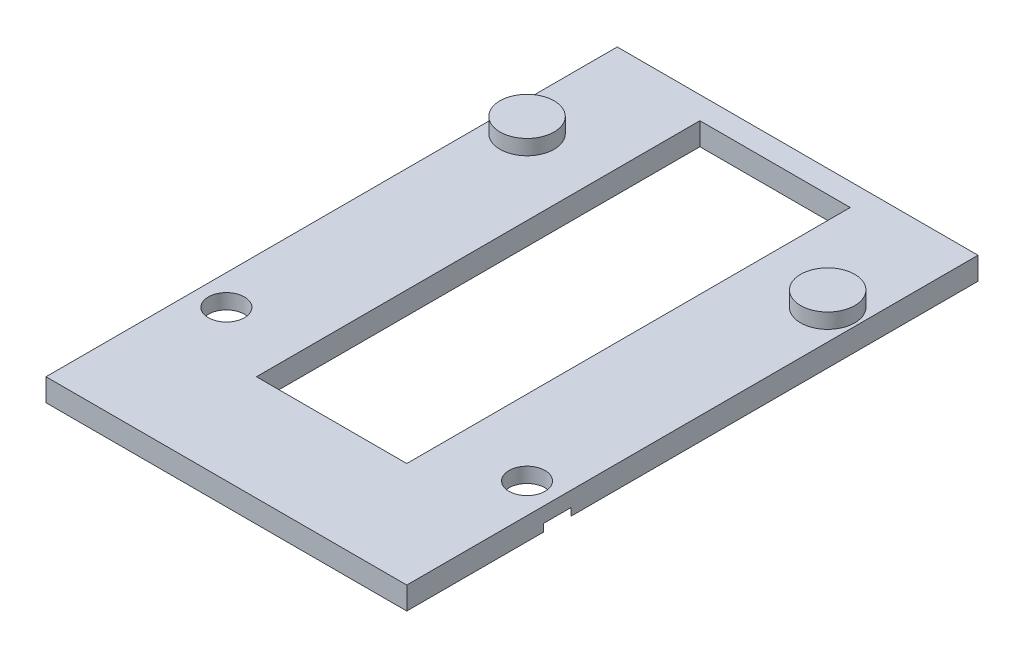
ISO-10303-21;
HEADER;
FILE_DESCRIPTION(('STEP AP214'),'2;1');
FILE_NAME('part.step','',(''),(''),'','','');
FILE_SCHEMA(('AUTOMOTIVE_DESIGN { 1 0 10303 214 1 1 1 1 }'));
ENDSEC;
DATA;
#1=APPLICATION_CONTEXT('core data for automotive mechanical design processes');
#2=APPLICATION_PROTOCOL_DEFINITION('international standard','automotive_design',2000,#1);
#3=PRODUCT_CONTEXT('',#1,'mechanical');
#4=PRODUCT('Part','Part','',(#3));
#5=PRODUCT_RELATED_PRODUCT_CATEGORY('part','',(#4));
#6=PRODUCT_DEFINITION_FORMATION('','',#4);
#7=PRODUCT_DEFINITION_CONTEXT('part definition',#1,'design');
#8=PRODUCT_DEFINITION('design','',#6,#7);
#9=PRODUCT_DEFINITION_SHAPE('','',#8);
#10=(LENGTH_UNIT() NAMED_UNIT(*) SI_UNIT(.MILLI.,.METRE.));
#11=(NAMED_UNIT(*) PLANE_ANGLE_UNIT() SI_UNIT($,.RADIAN.));
#12=(NAMED_UNIT(*) SI_UNIT($,.STERADIAN.) SOLID_ANGLE_UNIT());
#13=UNCERTAINTY_MEASURE_WITH_UNIT(LENGTH_MEASURE(1.E-05),#10,'distance_accuracy_value','');
#14=(GEOMETRIC_REPRESENTATION_CONTEXT(3) GLOBAL_UNCERTAINTY_ASSIGNED_CONTEXT((#13)) GLOBAL_UNIT_ASSIGNED_CONTEXT((#10,
#11,#12)) REPRESENTATION_CONTEXT('',''));
#15=CARTESIAN_POINT('',(0.,0.,0.));
#16=DIRECTION('',(0.,0.,1.));
#17=DIRECTION('',(1.,0.,0.));
#18=AXIS2_PLACEMENT_3D('',#15,#16,#17);
#19=CARTESIAN_POINT('',(12.,1.5,19.));
#20=DIRECTION('',(-1.,0.,0.));
#21=DIRECTION('',(0.,0.,1.));
#22=AXIS2_PLACEMENT_3D('',#19,#20,#21);
#23=PLANE('',#22);
#24=DIRECTION('',(0.,-1.,0.));
#25=VECTOR('',#24,1.);
#26=CARTESIAN_POINT('',(12.,0.5,8.08348486100883));
#27=LINE('',#26,#25);
#28=CARTESIAN_POINT('',(12.,0.,8.08348486100883));
#29=VERTEX_POINT('',#28);
#30=CARTESIAN_POINT('',(12.,0.5,8.08348486100883));
#31=VERTEX_POINT('',#30);
#32=EDGE_CURVE('E176',#29,#31,#27,.F.);
#33=ORIENTED_EDGE('',*,*,#32,.F.);
#34=DIRECTION('',(0.,0.,-1.));
#35=VECTOR('',#34,1.);
#36=CARTESIAN_POINT('',(12.,0.,19.));
#37=LINE('',#36,#35);
#38=CARTESIAN_POINT('',(12.,0.,-19.));
#39=VERTEX_POINT('',#38);
#40=EDGE_CURVE('E185',#29,#39,#37,.T.);
#41=ORIENTED_EDGE('',*,*,#40,.T.);
#42=DIRECTION('',(0.,-1.,0.));
#43=VECTOR('',#42,1.);
#44=CARTESIAN_POINT('',(12.,1.5,-19.));
#45=LINE('',#44,#43);
#46=CARTESIAN_POINT('',(12.,1.5,-19.));
#47=VERTEX_POINT('',#46);
#48=EDGE_CURVE('E164',#47,#39,#45,.T.);
#49=ORIENTED_EDGE('',*,*,#48,.F.);
#50=DIRECTION('',(0.,0.,-1.));
#51=VECTOR('',#50,1.);
#52=CARTESIAN_POINT('',(12.,1.5,19.));
#53=LINE('',#52,#51);
#54=CARTESIAN_POINT('',(12.,1.5,19.));
#55=VERTEX_POINT('',#54);
#56=EDGE_CURVE('E154',#55,#47,#53,.T.);
#57=ORIENTED_EDGE('',*,*,#56,.F.);
#58=DIRECTION('',(0.,-1.,0.));
#59=VECTOR('',#58,1.);
#60=CARTESIAN_POINT('',(12.,1.5,19.));
#61=LINE('',#60,#59);
#62=CARTESIAN_POINT('',(12.,0.,19.));
#63=VERTEX_POINT('',#62);
#64=EDGE_CURVE('E155',#55,#63,#61,.T.);
#65=ORIENTED_EDGE('',*,*,#64,.T.);
#66=CARTESIAN_POINT('',(12.,0.,9.91651513899116));
#67=VERTEX_POINT('',#66);
#68=EDGE_CURVE('E149',#63,#67,#37,.T.);
#69=ORIENTED_EDGE('',*,*,#68,.T.);
#70=DIRECTION('',(0.,-1.,0.));
#71=VECTOR('',#70,1.);
#72=CARTESIAN_POINT('',(12.,0.5,9.91651513899116));
#73=LINE('',#72,#71);
#74=CARTESIAN_POINT('',(12.,0.5,9.91651513899116));
#75=VERTEX_POINT('',#74);
#76=EDGE_CURVE('E170',#75,#67,#73,.T.);
#77=ORIENTED_EDGE('',*,*,#76,.F.);
#78=DIRECTION('',(0.,0.,-1.));
#79=VECTOR('',#78,1.);
#80=CARTESIAN_POINT('',(12.,0.5,19.));
#81=LINE('',#80,#79);
#82=EDGE_CURVE('E174',#75,#31,#81,.T.);
#83=ORIENTED_EDGE('',*,*,#82,.T.);
#84=EDGE_LOOP('',(#33,#41,#49,#57,#65,#69,#77,#83));
#85=FACE_BOUND('',#84,.T.);
#86=ADVANCED_FACE('F39',(#85),#23,.F.);
#87=CARTESIAN_POINT('',(0.,1.5,0.));
#88=DIRECTION('',(0.,-1.,0.));
#89=DIRECTION('',(0.,0.,-1.));
#90=AXIS2_PLACEMENT_3D('',#87,#88,#89);
#91=PLANE('',#90);
#92=CARTESIAN_POINT('',(-10.,1.5,-11.));
#93=DIRECTION('',(0.,-1.,0.));
#94=DIRECTION('',(0.,0.,1.));
#95=AXIS2_PLACEMENT_3D('',#92,#93,#94);
#96=CIRCLE('',#95,1.8);
#97=CARTESIAN_POINT('',(-10.,1.5,-9.2));
#98=VERTEX_POINT('',#97);
#99=EDGE_CURVE('E247',#98,#98,#96,.T.);
#100=ORIENTED_EDGE('',*,*,#99,.T.);
#101=EDGE_LOOP('',(#100));
#102=FACE_BOUND('',#101,.T.);
#103=CARTESIAN_POINT('',(-10.,1.5,8.99999999999999));
#104=DIRECTION('',(0.,-1.,0.));
#105=DIRECTION('',(0.,0.,1.));
#106=AXIS2_PLACEMENT_3D('',#103,#104,#105);
#107=CIRCLE('',#106,1.2);
#108=CARTESIAN_POINT('',(-10.,1.5,10.2));
#109=VERTEX_POINT('',#108);
#110=EDGE_CURVE('E242',#109,#109,#107,.T.);
#111=ORIENTED_EDGE('',*,*,#110,.T.);
#112=EDGE_LOOP('',(#111));
#113=FACE_BOUND('',#112,.T.);
#114=CARTESIAN_POINT('',(10.,1.5,-11.));
#115=DIRECTION('',(0.,-1.,0.));
#116=DIRECTION('',(0.,0.,-1.));
#117=AXIS2_PLACEMENT_3D('',#114,#115,#116);
#118=CIRCLE('',#117,1.8);
#119=CARTESIAN_POINT('',(10.,1.5,-12.8));
#120=VERTEX_POINT('',#119);
#121=EDGE_CURVE('E167',#120,#120,#118,.F.);
#122=ORIENTED_EDGE('',*,*,#121,.F.);
#123=EDGE_LOOP('',(#122));
#124=FACE_BOUND('',#123,.T.);
#125=CARTESIAN_POINT('',(10.,1.5,8.99999999999999));
#126=DIRECTION('',(0.,1.,0.));
#127=DIRECTION('',(0.,0.,1.));
#128=AXIS2_PLACEMENT_3D('',#125,#126,#127);
#129=CIRCLE('',#128,1.2);
#130=CARTESIAN_POINT('',(10.,1.5,10.2));
#131=VERTEX_POINT('',#130);
#132=EDGE_CURVE('E226',#131,#131,#129,.T.);
#133=ORIENTED_EDGE('',*,*,#132,.F.);
#134=EDGE_LOOP('',(#133));
#135=FACE_BOUND('',#134,.T.);
#136=ORIENTED_EDGE('',*,*,#56,.T.);
#137=DIRECTION('',(-1.,0.,0.));
#138=VECTOR('',#137,1.);
#139=CARTESIAN_POINT('',(-12.,1.5,-19.));
#140=LINE('',#139,#138);
#141=CARTESIAN_POINT('',(-12.,1.5,-19.));
#142=VERTEX_POINT('',#141);
#143=EDGE_CURVE('E189',#47,#142,#140,.T.);
#144=ORIENTED_EDGE('',*,*,#143,.T.);
#145=DIRECTION('',(0.,0.,1.));
#146=VECTOR('',#145,1.);
#147=CARTESIAN_POINT('',(-12.,1.5,19.));
#148=LINE('',#147,#146);
#149=CARTESIAN_POINT('',(-12.,1.5,19.));
#150=VERTEX_POINT('',#149);
#151=EDGE_CURVE('E202',#142,#150,#148,.T.);
#152=ORIENTED_EDGE('',*,*,#151,.T.);
#153=DIRECTION('',(1.,0.,0.));
#154=VECTOR('',#153,1.);
#155=CARTESIAN_POINT('',(-12.,1.5,19.));
#156=LINE('',#155,#154);
#157=EDGE_CURVE('E159',#150,#55,#156,.T.);
#158=ORIENTED_EDGE('',*,*,#157,.T.);
#159=EDGE_LOOP('',(#136,#144,#152,#158));
#160=FACE_BOUND('',#159,.T.);
#161=DIRECTION('',(0.,0.,-1.));
#162=VECTOR('',#161,1.);
#163=CARTESIAN_POINT('',(5.,1.5,12.));
#164=LINE('',#163,#162);
#165=CARTESIAN_POINT('',(5.,1.5,12.));
#166=VERTEX_POINT('',#165);
#167=CARTESIAN_POINT('',(5.,1.5,-17.5));
#168=VERTEX_POINT('',#167);
#169=EDGE_CURVE('E216',#166,#168,#164,.T.);
#170=ORIENTED_EDGE('',*,*,#169,.F.);
#171=DIRECTION('',(1.,0.,0.));
#172=VECTOR('',#171,1.);
#173=CARTESIAN_POINT('',(-5.,1.5,12.));
#174=LINE('',#173,#172);
#175=CARTESIAN_POINT('',(-5.,1.5,12.));
#176=VERTEX_POINT('',#175);
#177=EDGE_CURVE('E212',#176,#166,#174,.T.);
#178=ORIENTED_EDGE('',*,*,#177,.F.);
#179=DIRECTION('',(0.,0.,1.));
#180=VECTOR('',#179,1.);
#181=CARTESIAN_POINT('',(-5.,1.5,12.));
#182=LINE('',#181,#180);
#183=CARTESIAN_POINT('',(-5.,1.5,-17.5));
#184=VERTEX_POINT('',#183);
#185=EDGE_CURVE('E228',#184,#176,#182,.T.);
#186=ORIENTED_EDGE('',*,*,#185,.F.);
#187=DIRECTION('',(-1.,0.,0.));
#188=VECTOR('',#187,1.);
#189=CARTESIAN_POINT('',(-5.,1.5,-17.5));
#190=LINE('',#189,#188);
#191=EDGE_CURVE('E231',#168,#184,#190,.T.);
#192=ORIENTED_EDGE('',*,*,#191,.F.);
#193=EDGE_LOOP('',(#170,#178,#186,#192));
#194=FACE_BOUND('',#193,.T.);
#195=ADVANCED_FACE('F270',(#102,#113,#124,#135,#160,#194),#91,.F.);
#196=CARTESIAN_POINT('',(0.,0.,0.));
#197=DIRECTION('',(0.,-1.,0.));
#198=DIRECTION('',(0.,0.,-1.));
#199=AXIS2_PLACEMENT_3D('',#196,#197,#198);
#200=PLANE('',#199);
#201=CARTESIAN_POINT('',(-10.,0.,8.99999999999999));
#202=DIRECTION('',(0.,-1.,0.));
#203=DIRECTION('',(0.,0.,1.));
#204=AXIS2_PLACEMENT_3D('',#201,#202,#203);
#205=CIRCLE('',#204,2.2);
#206=CARTESIAN_POINT('',(-12.,0.,8.08348486100881));
#207=VERTEX_POINT('',#206);
#208=CARTESIAN_POINT('',(-12.,0.,9.91651513899117));
#209=VERTEX_POINT('',#208);
#210=EDGE_CURVE('E126',#207,#209,#205,.T.);
#211=ORIENTED_EDGE('',*,*,#210,.F.);
#212=DIRECTION('',(0.,0.,1.));
#213=VECTOR('',#212,1.);
#214=CARTESIAN_POINT('',(-12.,0.,19.));
#215=LINE('',#214,#213);
#216=CARTESIAN_POINT('',(-12.,0.,-19.));
#217=VERTEX_POINT('',#216);
#218=EDGE_CURVE('E146',#217,#207,#215,.T.);
#219=ORIENTED_EDGE('',*,*,#218,.F.);
#220=DIRECTION('',(-1.,0.,0.));
#221=VECTOR('',#220,1.);
#222=CARTESIAN_POINT('',(-12.,0.,-19.));
#223=LINE('',#222,#221);
#224=EDGE_CURVE('E147',#39,#217,#223,.T.);
#225=ORIENTED_EDGE('',*,*,#224,.F.);
#226=ORIENTED_EDGE('',*,*,#40,.F.);
#227=CARTESIAN_POINT('',(10.,0.,8.99999999999999));
#228=DIRECTION('',(0.,1.,0.));
#229=DIRECTION('',(0.,0.,1.));
#230=AXIS2_PLACEMENT_3D('',#227,#228,#229);
#231=CIRCLE('',#230,2.2);
#232=EDGE_CURVE('E240',#29,#67,#231,.T.);
#233=ORIENTED_EDGE('',*,*,#232,.T.);
#234=ORIENTED_EDGE('',*,*,#68,.F.);
#235=DIRECTION('',(1.,0.,0.));
#236=VECTOR('',#235,1.);
#237=CARTESIAN_POINT('',(-12.,0.,19.));
#238=LINE('',#237,#236);
#239=CARTESIAN_POINT('',(-12.,0.,19.));
#240=VERTEX_POINT('',#239);
#241=EDGE_CURVE('E145',#240,#63,#238,.T.);
#242=ORIENTED_EDGE('',*,*,#241,.F.);
#243=EDGE_CURVE('E138',#209,#240,#215,.T.);
#244=ORIENTED_EDGE('',*,*,#243,.F.);
#245=EDGE_LOOP('',(#211,#219,#225,#226,#233,#234,#242,#244));
#246=FACE_BOUND('',#245,.T.);
#247=DIRECTION('',(1.,0.,0.));
#248=VECTOR('',#247,1.);
#249=CARTESIAN_POINT('',(-5.,0.,12.));
#250=LINE('',#249,#248);
#251=CARTESIAN_POINT('',(-5.,0.,12.));
#252=VERTEX_POINT('',#251);
#253=CARTESIAN_POINT('',(5.,0.,12.));
#254=VERTEX_POINT('',#253);
#255=EDGE_CURVE('E213',#252,#254,#250,.T.);
#256=ORIENTED_EDGE('',*,*,#255,.T.);
#257=DIRECTION('',(0.,0.,-1.));
#258=VECTOR('',#257,1.);
#259=CARTESIAN_POINT('',(5.,0.,12.));
#260=LINE('',#259,#258);
#261=CARTESIAN_POINT('',(5.,0.,-17.5));
#262=VERTEX_POINT('',#261);
#263=EDGE_CURVE('E223',#254,#262,#260,.T.);
#264=ORIENTED_EDGE('',*,*,#263,.T.);
#265=DIRECTION('',(-1.,0.,0.));
#266=VECTOR('',#265,1.);
#267=CARTESIAN_POINT('',(-5.,0.,-17.5));
#268=LINE('',#267,#266);
#269=CARTESIAN_POINT('',(-5.,0.,-17.5));
#270=VERTEX_POINT('',#269);
#271=EDGE_CURVE('E220',#262,#270,#268,.T.);
#272=ORIENTED_EDGE('',*,*,#271,.T.);
#273=DIRECTION('',(0.,0.,1.));
#274=VECTOR('',#273,1.);
#275=CARTESIAN_POINT('',(-5.,0.,12.));
#276=LINE('',#275,#274);
#277=EDGE_CURVE('E217',#270,#252,#276,.T.);
#278=ORIENTED_EDGE('',*,*,#277,.T.);
#279=EDGE_LOOP('',(#256,#264,#272,#278));
#280=FACE_BOUND('',#279,.T.);
#281=ADVANCED_FACE('F142',(#246,#280),#200,.T.);
#282=CARTESIAN_POINT('',(-12.,1.5,-19.));
#283=DIRECTION('',(0.,0.,1.));
#284=DIRECTION('',(1.,0.,0.));
#285=AXIS2_PLACEMENT_3D('',#282,#283,#284);
#286=PLANE('',#285);
#287=ORIENTED_EDGE('',*,*,#224,.T.);
#288=DIRECTION('',(0.,-1.,0.));
#289=VECTOR('',#288,1.);
#290=CARTESIAN_POINT('',(-12.,1.5,-19.));
#291=LINE('',#290,#289);
#292=EDGE_CURVE('E161',#142,#217,#291,.T.);
#293=ORIENTED_EDGE('',*,*,#292,.F.);
#294=ORIENTED_EDGE('',*,*,#143,.F.);
#295=ORIENTED_EDGE('',*,*,#48,.T.);
#296=EDGE_LOOP('',(#287,#293,#294,#295));
#297=FACE_BOUND('',#296,.T.);
#298=ADVANCED_FACE('F188',(#297),#286,.F.);
#299=CARTESIAN_POINT('',(-12.,1.5,19.));
#300=DIRECTION('',(1.,0.,0.));
#301=DIRECTION('',(0.,0.,-1.));
#302=AXIS2_PLACEMENT_3D('',#299,#300,#301);
#303=PLANE('',#302);
#304=DIRECTION('',(0.,0.,1.));
#305=VECTOR('',#304,1.);
#306=CARTESIAN_POINT('',(-12.,0.5,19.));
#307=LINE('',#306,#305);
#308=CARTESIAN_POINT('',(-12.,0.5,8.08348486100881));
#309=VERTEX_POINT('',#308);
#310=CARTESIAN_POINT('',(-12.,0.5,9.91651513899117));
#311=VERTEX_POINT('',#310);
#312=EDGE_CURVE('E140',#309,#311,#307,.T.);
#313=ORIENTED_EDGE('',*,*,#312,.T.);
#314=DIRECTION('',(0.,-1.,0.));
#315=VECTOR('',#314,1.);
#316=CARTESIAN_POINT('',(-12.,0.5,9.91651513899117));
#317=LINE('',#316,#315);
#318=EDGE_CURVE('E11',#311,#209,#317,.T.);
#319=ORIENTED_EDGE('',*,*,#318,.T.);
#320=ORIENTED_EDGE('',*,*,#243,.T.);
#321=DIRECTION('',(0.,-1.,0.));
#322=VECTOR('',#321,1.);
#323=CARTESIAN_POINT('',(-12.,1.5,19.));
#324=LINE('',#323,#322);
#325=EDGE_CURVE('E158',#150,#240,#324,.T.);
#326=ORIENTED_EDGE('',*,*,#325,.F.);
#327=ORIENTED_EDGE('',*,*,#151,.F.);
#328=ORIENTED_EDGE('',*,*,#292,.T.);
#329=ORIENTED_EDGE('',*,*,#218,.T.);
#330=DIRECTION('',(0.,-1.,0.));
#331=VECTOR('',#330,1.);
#332=CARTESIAN_POINT('',(-12.,0.5,8.08348486100881));
#333=LINE('',#332,#331);
#334=EDGE_CURVE('E46',#207,#309,#333,.F.);
#335=ORIENTED_EDGE('',*,*,#334,.T.);
#336=EDGE_LOOP('',(#313,#319,#320,#326,#327,#328,#329,#335));
#337=FACE_BOUND('',#336,.T.);
#338=ADVANCED_FACE('F136',(#337),#303,.F.);
#339=CARTESIAN_POINT('',(-12.,1.5,19.));
#340=DIRECTION('',(0.,0.,-1.));
#341=DIRECTION('',(-1.,0.,0.));
#342=AXIS2_PLACEMENT_3D('',#339,#340,#341);
#343=PLANE('',#342);
#344=ORIENTED_EDGE('',*,*,#241,.T.);
#345=ORIENTED_EDGE('',*,*,#64,.F.);
#346=ORIENTED_EDGE('',*,*,#157,.F.);
#347=ORIENTED_EDGE('',*,*,#325,.T.);
#348=EDGE_LOOP('',(#344,#345,#346,#347));
#349=FACE_BOUND('',#348,.T.);
#350=ADVANCED_FACE('F285',(#349),#343,.F.);
#351=CARTESIAN_POINT('',(5.,1.5,12.));
#352=DIRECTION('',(-1.,0.,0.));
#353=DIRECTION('',(0.,0.,1.));
#354=AXIS2_PLACEMENT_3D('',#351,#352,#353);
#355=PLANE('',#354);
#356=ORIENTED_EDGE('',*,*,#263,.F.);
#357=DIRECTION('',(0.,-1.,0.));
#358=VECTOR('',#357,1.);
#359=CARTESIAN_POINT('',(5.,1.5,12.));
#360=LINE('',#359,#358);
#361=EDGE_CURVE('E209',#166,#254,#360,.T.);
#362=ORIENTED_EDGE('',*,*,#361,.F.);
#363=ORIENTED_EDGE('',*,*,#169,.T.);
#364=DIRECTION('',(0.,-1.,0.));
#365=VECTOR('',#364,1.);
#366=CARTESIAN_POINT('',(5.,1.5,-17.5));
#367=LINE('',#366,#365);
#368=EDGE_CURVE('E195',#168,#262,#367,.T.);
#369=ORIENTED_EDGE('',*,*,#368,.T.);
#370=EDGE_LOOP('',(#356,#362,#363,#369));
#371=FACE_BOUND('',#370,.T.);
#372=ADVANCED_FACE('F282',(#371),#355,.T.);
#373=CARTESIAN_POINT('',(-5.,1.5,-17.5));
#374=DIRECTION('',(0.,0.,1.));
#375=DIRECTION('',(1.,0.,0.));
#376=AXIS2_PLACEMENT_3D('',#373,#374,#375);
#377=PLANE('',#376);
#378=ORIENTED_EDGE('',*,*,#271,.F.);
#379=ORIENTED_EDGE('',*,*,#368,.F.);
#380=ORIENTED_EDGE('',*,*,#191,.T.);
#381=DIRECTION('',(0.,-1.,0.));
#382=VECTOR('',#381,1.);
#383=CARTESIAN_POINT('',(-5.,1.5,-17.5));
#384=LINE('',#383,#382);
#385=EDGE_CURVE('E198',#184,#270,#384,.T.);
#386=ORIENTED_EDGE('',*,*,#385,.T.);
#387=EDGE_LOOP('',(#378,#379,#380,#386));
#388=FACE_BOUND('',#387,.T.);
#389=ADVANCED_FACE('F310',(#388),#377,.T.);
#390=CARTESIAN_POINT('',(-5.,1.5,12.));
#391=DIRECTION('',(1.,0.,0.));
#392=DIRECTION('',(0.,0.,-1.));
#393=AXIS2_PLACEMENT_3D('',#390,#391,#392);
#394=PLANE('',#393);
#395=ORIENTED_EDGE('',*,*,#277,.F.);
#396=ORIENTED_EDGE('',*,*,#385,.F.);
#397=ORIENTED_EDGE('',*,*,#185,.T.);
#398=DIRECTION('',(0.,-1.,0.));
#399=VECTOR('',#398,1.);
#400=CARTESIAN_POINT('',(-5.,1.5,12.));
#401=LINE('',#400,#399);
#402=EDGE_CURVE('E207',#176,#252,#401,.T.);
#403=ORIENTED_EDGE('',*,*,#402,.T.);
#404=EDGE_LOOP('',(#395,#396,#397,#403));
#405=FACE_BOUND('',#404,.T.);
#406=ADVANCED_FACE('F317',(#405),#394,.T.);
#407=CARTESIAN_POINT('',(-5.,1.5,12.));
#408=DIRECTION('',(0.,0.,-1.));
#409=DIRECTION('',(-1.,0.,0.));
#410=AXIS2_PLACEMENT_3D('',#407,#408,#409);
#411=PLANE('',#410);
#412=ORIENTED_EDGE('',*,*,#255,.F.);
#413=ORIENTED_EDGE('',*,*,#402,.F.);
#414=ORIENTED_EDGE('',*,*,#177,.T.);
#415=ORIENTED_EDGE('',*,*,#361,.T.);
#416=EDGE_LOOP('',(#412,#413,#414,#415));
#417=FACE_BOUND('',#416,.T.);
#418=ADVANCED_FACE('F324',(#417),#411,.T.);
#419=CARTESIAN_POINT('',(10.,0.,8.99999999999999));
#420=DIRECTION('',(0.,1.,0.));
#421=DIRECTION('',(0.,0.,1.));
#422=AXIS2_PLACEMENT_3D('',#419,#420,#421);
#423=CYLINDRICAL_SURFACE('',#422,1.2);
#424=CARTESIAN_POINT('',(10.,0.5,8.99999999999999));
#425=DIRECTION('',(0.,1.,0.));
#426=DIRECTION('',(0.,0.,1.));
#427=AXIS2_PLACEMENT_3D('',#424,#425,#426);
#428=CIRCLE('',#427,1.2);
#429=CARTESIAN_POINT('',(10.,0.5,10.2));
#430=VERTEX_POINT('',#429);
#431=EDGE_CURVE('E171',#430,#430,#428,.F.);
#432=ORIENTED_EDGE('',*,*,#431,.T.);
#433=EDGE_LOOP('',(#432));
#434=FACE_BOUND('',#433,.T.);
#435=ORIENTED_EDGE('',*,*,#132,.T.);
#436=EDGE_LOOP('',(#435));
#437=FACE_BOUND('',#436,.T.);
#438=ADVANCED_FACE('F332',(#434,#437),#423,.F.);
#439=CARTESIAN_POINT('',(10.,2.5,-11.));
#440=DIRECTION('',(0.,-1.,0.));
#441=DIRECTION('',(0.,0.,-1.));
#442=AXIS2_PLACEMENT_3D('',#439,#440,#441);
#443=CYLINDRICAL_SURFACE('',#442,1.8);
#444=CARTESIAN_POINT('',(10.,2.5,-11.));
#445=DIRECTION('',(0.,1.,0.));
#446=DIRECTION('',(0.,0.,1.));
#447=AXIS2_PLACEMENT_3D('',#444,#445,#446);
#448=CIRCLE('',#447,1.8);
#449=CARTESIAN_POINT('',(10.,2.5,-9.2));
#450=VERTEX_POINT('',#449);
#451=EDGE_CURVE('E236',#450,#450,#448,.T.);
#452=ORIENTED_EDGE('',*,*,#451,.F.);
#453=EDGE_LOOP('',(#452));
#454=FACE_BOUND('',#453,.T.);
#455=ORIENTED_EDGE('',*,*,#121,.T.);
#456=EDGE_LOOP('',(#455));
#457=FACE_BOUND('',#456,.T.);
#458=ADVANCED_FACE('F341',(#454,#457),#443,.T.);
#459=CARTESIAN_POINT('',(0.,2.5,0.));
#460=DIRECTION('',(0.,1.,0.));
#461=DIRECTION('',(0.,0.,1.));
#462=AXIS2_PLACEMENT_3D('',#459,#460,#461);
#463=PLANE('',#462);
#464=ORIENTED_EDGE('',*,*,#451,.T.);
#465=EDGE_LOOP('',(#464));
#466=FACE_BOUND('',#465,.T.);
#467=ADVANCED_FACE('F349',(#466),#463,.T.);
#468=CARTESIAN_POINT('',(10.,0.5,8.99999999999999));
#469=DIRECTION('',(0.,-1.,0.));
#470=DIRECTION('',(0.,0.,-1.));
#471=AXIS2_PLACEMENT_3D('',#468,#469,#470);
#472=CYLINDRICAL_SURFACE('',#471,2.2);
#473=ORIENTED_EDGE('',*,*,#32,.T.);
#474=CARTESIAN_POINT('',(10.,0.5,8.99999999999999));
#475=DIRECTION('',(0.,1.,0.));
#476=DIRECTION('',(0.,0.,1.));
#477=AXIS2_PLACEMENT_3D('',#474,#475,#476);
#478=CIRCLE('',#477,2.2);
#479=EDGE_CURVE('E59',#31,#75,#478,.T.);
#480=ORIENTED_EDGE('',*,*,#479,.T.);
#481=ORIENTED_EDGE('',*,*,#76,.T.);
#482=ORIENTED_EDGE('',*,*,#232,.F.);
#483=EDGE_LOOP('',(#473,#480,#481,#482));
#484=FACE_BOUND('',#483,.T.);
#485=ADVANCED_FACE('F357',(#484),#472,.F.);
#486=CARTESIAN_POINT('',(10.,0.5,8.99999999999999));
#487=DIRECTION('',(0.,1.,0.));
#488=DIRECTION('',(0.,0.,1.));
#489=AXIS2_PLACEMENT_3D('',#486,#487,#488);
#490=PLANE('',#489);
#491=ORIENTED_EDGE('',*,*,#431,.F.);
#492=EDGE_LOOP('',(#491));
#493=FACE_BOUND('',#492,.T.);
#494=ORIENTED_EDGE('',*,*,#479,.F.);
#495=ORIENTED_EDGE('',*,*,#82,.F.);
#496=EDGE_LOOP('',(#494,#495));
#497=FACE_BOUND('',#496,.T.);
#498=ADVANCED_FACE('F364',(#493,#497),#490,.F.);
#499=CARTESIAN_POINT('',(-10.,0.,8.99999999999999));
#500=DIRECTION('',(0.,1.,0.));
#501=DIRECTION('',(0.,0.,1.));
#502=AXIS2_PLACEMENT_3D('',#499,#500,#501);
#503=CYLINDRICAL_SURFACE('',#502,1.2);
#504=CARTESIAN_POINT('',(-10.,0.5,8.99999999999999));
#505=DIRECTION('',(0.,1.,0.));
#506=DIRECTION('',(0.,0.,1.));
#507=AXIS2_PLACEMENT_3D('',#504,#505,#506);
#508=CIRCLE('',#507,1.2);
#509=CARTESIAN_POINT('',(-10.,0.5,10.2));
#510=VERTEX_POINT('',#509);
#511=EDGE_CURVE('E178',#510,#510,#508,.T.);
#512=ORIENTED_EDGE('',*,*,#511,.F.);
#513=EDGE_LOOP('',(#512));
#514=FACE_BOUND('',#513,.T.);
#515=ORIENTED_EDGE('',*,*,#110,.F.);
#516=EDGE_LOOP('',(#515));
#517=FACE_BOUND('',#516,.T.);
#518=ADVANCED_FACE('F267',(#514,#517),#503,.F.);
#519=CARTESIAN_POINT('',(-10.,2.5,-11.));
#520=DIRECTION('',(0.,-1.,0.));
#521=DIRECTION('',(0.,0.,-1.));
#522=AXIS2_PLACEMENT_3D('',#519,#520,#521);
#523=CYLINDRICAL_SURFACE('',#522,1.8);
#524=CARTESIAN_POINT('',(-10.,2.5,-11.));
#525=DIRECTION('',(0.,-1.,0.));
#526=DIRECTION('',(0.,0.,1.));
#527=AXIS2_PLACEMENT_3D('',#524,#525,#526);
#528=CIRCLE('',#527,1.8);
#529=CARTESIAN_POINT('',(-10.,2.5,-9.2));
#530=VERTEX_POINT('',#529);
#531=EDGE_CURVE('E246',#530,#530,#528,.T.);
#532=ORIENTED_EDGE('',*,*,#531,.T.);
#533=EDGE_LOOP('',(#532));
#534=FACE_BOUND('',#533,.T.);
#535=ORIENTED_EDGE('',*,*,#99,.F.);
#536=EDGE_LOOP('',(#535));
#537=FACE_BOUND('',#536,.T.);
#538=ADVANCED_FACE('F255',(#534,#537),#523,.T.);
#539=CARTESIAN_POINT('',(0.,2.5,0.));
#540=DIRECTION('',(0.,1.,0.));
#541=DIRECTION('',(0.,0.,1.));
#542=AXIS2_PLACEMENT_3D('',#539,#540,#541);
#543=PLANE('',#542);
#544=ORIENTED_EDGE('',*,*,#531,.F.);
#545=EDGE_LOOP('',(#544));
#546=FACE_BOUND('',#545,.T.);
#547=ADVANCED_FACE('F258',(#546),#543,.T.);
#548=CARTESIAN_POINT('',(-10.,0.5,8.99999999999999));
#549=DIRECTION('',(0.,-1.,0.));
#550=DIRECTION('',(0.,0.,-1.));
#551=AXIS2_PLACEMENT_3D('',#548,#549,#550);
#552=CYLINDRICAL_SURFACE('',#551,2.2);
#553=CARTESIAN_POINT('',(-10.,0.5,8.99999999999999));
#554=DIRECTION('',(0.,-1.,0.));
#555=DIRECTION('',(0.,0.,1.));
#556=AXIS2_PLACEMENT_3D('',#553,#554,#555);
#557=CIRCLE('',#556,2.2);
#558=EDGE_CURVE('E52',#309,#311,#557,.T.);
#559=ORIENTED_EDGE('',*,*,#558,.F.);
#560=ORIENTED_EDGE('',*,*,#334,.F.);
#561=ORIENTED_EDGE('',*,*,#210,.T.);
#562=ORIENTED_EDGE('',*,*,#318,.F.);
#563=EDGE_LOOP('',(#559,#560,#561,#562));
#564=FACE_BOUND('',#563,.T.);
#565=ADVANCED_FACE('F127',(#564),#552,.F.);
#566=CARTESIAN_POINT('',(-10.,0.5,8.99999999999999));
#567=DIRECTION('',(0.,1.,0.));
#568=DIRECTION('',(0.,0.,1.));
#569=AXIS2_PLACEMENT_3D('',#566,#567,#568);
#570=PLANE('',#569);
#571=ORIENTED_EDGE('',*,*,#511,.T.);
#572=EDGE_LOOP('',(#571));
#573=FACE_BOUND('',#572,.T.);
#574=ORIENTED_EDGE('',*,*,#558,.T.);
#575=ORIENTED_EDGE('',*,*,#312,.F.);
#576=EDGE_LOOP('',(#574,#575));
#577=FACE_BOUND('',#576,.T.);
#578=ADVANCED_FACE('F265',(#573,#577),#570,.F.);
#579=CLOSED_SHELL('',(#86,#195,#281,#298,#338,#350,#372,#389,#406,#418,#438,#458,#467,#485,#498,
#518,#538,#547,#565,#578));
#580=MANIFOLD_SOLID_BREP('B2',#579);
#581=ADVANCED_BREP_SHAPE_REPRESENTATION('',(#18,#580),#14);
#582=SHAPE_DEFINITION_REPRESENTATION(#9,#581);
ENDSEC;
END-ISO-10303-21;
